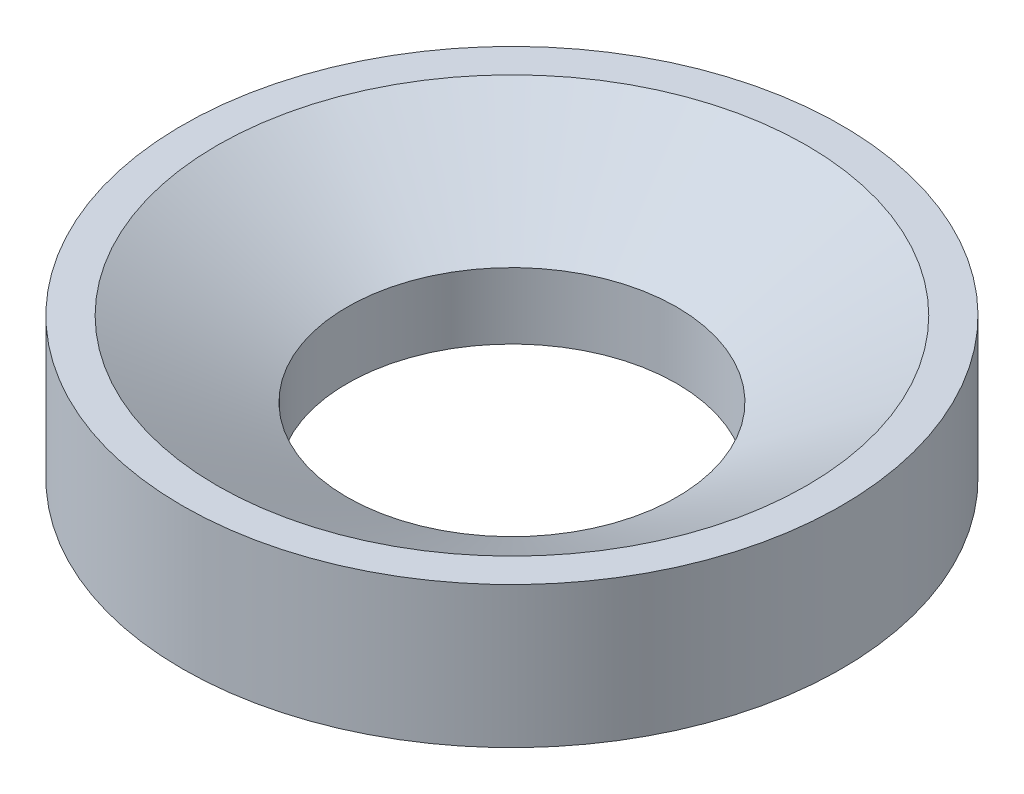
ISO-10303-21;
HEADER;
FILE_DESCRIPTION(('STEP AP214'),'2;1');
FILE_NAME('part.step','',(''),(''),'','','');
FILE_SCHEMA(('AUTOMOTIVE_DESIGN { 1 0 10303 214 1 1 1 1 }'));
ENDSEC;
DATA;
#1=APPLICATION_CONTEXT('core data for automotive mechanical design processes');
#2=APPLICATION_PROTOCOL_DEFINITION('international standard','automotive_design',2000,#1);
#3=PRODUCT_CONTEXT('',#1,'mechanical');
#4=PRODUCT('Part','Part','',(#3));
#5=PRODUCT_RELATED_PRODUCT_CATEGORY('part','',(#4));
#6=PRODUCT_DEFINITION_FORMATION('','',#4);
#7=PRODUCT_DEFINITION_CONTEXT('part definition',#1,'design');
#8=PRODUCT_DEFINITION('design','',#6,#7);
#9=PRODUCT_DEFINITION_SHAPE('','',#8);
#10=(LENGTH_UNIT() NAMED_UNIT(*) SI_UNIT(.MILLI.,.METRE.));
#11=(NAMED_UNIT(*) PLANE_ANGLE_UNIT() SI_UNIT($,.RADIAN.));
#12=(NAMED_UNIT(*) SI_UNIT($,.STERADIAN.) SOLID_ANGLE_UNIT());
#13=UNCERTAINTY_MEASURE_WITH_UNIT(LENGTH_MEASURE(1.E-05),#10,'distance_accuracy_value','');
#14=(GEOMETRIC_REPRESENTATION_CONTEXT(3) GLOBAL_UNCERTAINTY_ASSIGNED_CONTEXT((#13)) GLOBAL_UNIT_ASSIGNED_CONTEXT((#10,
#11,#12)) REPRESENTATION_CONTEXT('',''));
#15=CARTESIAN_POINT('',(0.,0.,0.));
#16=DIRECTION('',(0.,0.,1.));
#17=DIRECTION('',(1.,0.,0.));
#18=AXIS2_PLACEMENT_3D('',#15,#16,#17);
#19=CARTESIAN_POINT('',(0.,44.6684275184275,0.));
#20=DIRECTION('',(0.,1.,0.));
#21=DIRECTION('',(0.,0.,1.));
#22=AXIS2_PLACEMENT_3D('',#19,#20,#21);
#23=CYLINDRICAL_SURFACE('',#22,44.45);
#24=CARTESIAN_POINT('',(0.,0.,0.));
#25=DIRECTION('',(0.,1.,0.));
#26=DIRECTION('',(0.,0.,1.));
#27=AXIS2_PLACEMENT_3D('',#24,#25,#26);
#28=CIRCLE('',#27,44.45);
#29=CARTESIAN_POINT('',(0.,0.,44.45));
#30=VERTEX_POINT('',#29);
#31=EDGE_CURVE('E49',#30,#30,#28,.T.);
#32=ORIENTED_EDGE('',*,*,#31,.F.);
#33=EDGE_LOOP('',(#32));
#34=FACE_BOUND('',#33,.T.);
#35=CARTESIAN_POINT('',(0.,17.8594755567107,0.));
#36=DIRECTION('',(0.,1.,0.));
#37=DIRECTION('',(0.,0.,1.));
#38=AXIS2_PLACEMENT_3D('',#35,#36,#37);
#39=CIRCLE('',#38,44.45);
#40=CARTESIAN_POINT('',(0.,17.8594755567107,44.45));
#41=VERTEX_POINT('',#40);
#42=EDGE_CURVE('E10',#41,#41,#39,.T.);
#43=ORIENTED_EDGE('',*,*,#42,.T.);
#44=EDGE_LOOP('',(#43));
#45=FACE_BOUND('',#44,.T.);
#46=ADVANCED_FACE('F30',(#34,#45),#23,.F.);
#47=CARTESIAN_POINT('',(0.,38.1,0.));
#48=DIRECTION('',(0.,1.,0.));
#49=DIRECTION('',(0.,0.,1.));
#50=AXIS2_PLACEMENT_3D('',#47,#48,#49);
#51=CONICAL_SURFACE('',#50,79.5076167076167,1.0471975511966);
#52=ORIENTED_EDGE('',*,*,#42,.F.);
#53=EDGE_LOOP('',(#52));
#54=FACE_BOUND('',#53,.T.);
#55=CARTESIAN_POINT('',(0.,38.1,0.));
#56=DIRECTION('',(0.,1.,0.));
#57=DIRECTION('',(0.,0.,1.));
#58=AXIS2_PLACEMENT_3D('',#55,#56,#57);
#59=CIRCLE('',#58,79.5076167076167);
#60=CARTESIAN_POINT('',(0.,38.1,79.5076167076167));
#61=VERTEX_POINT('',#60);
#62=EDGE_CURVE('E36',#61,#61,#59,.T.);
#63=ORIENTED_EDGE('',*,*,#62,.T.);
#64=EDGE_LOOP('',(#63));
#65=FACE_BOUND('',#64,.T.);
#66=ADVANCED_FACE('F56',(#54,#65),#51,.F.);
#67=CARTESIAN_POINT('',(79.5076167076167,38.1,0.));
#68=DIRECTION('',(0.,-1.,0.));
#69=DIRECTION('',(0.,0.,-1.));
#70=AXIS2_PLACEMENT_3D('',#67,#68,#69);
#71=PLANE('',#70);
#72=ORIENTED_EDGE('',*,*,#62,.F.);
#73=EDGE_LOOP('',(#72));
#74=FACE_BOUND('',#73,.T.);
#75=CARTESIAN_POINT('',(0.,38.1,0.));
#76=DIRECTION('',(0.,1.,0.));
#77=DIRECTION('',(0.,0.,1.));
#78=AXIS2_PLACEMENT_3D('',#75,#76,#77);
#79=CIRCLE('',#78,88.9);
#80=CARTESIAN_POINT('',(0.,38.1,88.9));
#81=VERTEX_POINT('',#80);
#82=EDGE_CURVE('E40',#81,#81,#79,.T.);
#83=ORIENTED_EDGE('',*,*,#82,.T.);
#84=EDGE_LOOP('',(#83));
#85=FACE_BOUND('',#84,.T.);
#86=ADVANCED_FACE('F60',(#74,#85),#71,.F.);
#87=CARTESIAN_POINT('',(0.,44.6684275184275,0.));
#88=DIRECTION('',(0.,1.,0.));
#89=DIRECTION('',(0.,0.,1.));
#90=AXIS2_PLACEMENT_3D('',#87,#88,#89);
#91=CYLINDRICAL_SURFACE('',#90,88.9);
#92=ORIENTED_EDGE('',*,*,#82,.F.);
#93=EDGE_LOOP('',(#92));
#94=FACE_BOUND('',#93,.T.);
#95=CARTESIAN_POINT('',(0.,0.,0.));
#96=DIRECTION('',(0.,1.,0.));
#97=DIRECTION('',(0.,0.,1.));
#98=AXIS2_PLACEMENT_3D('',#95,#96,#97);
#99=CIRCLE('',#98,88.9);
#100=CARTESIAN_POINT('',(0.,0.,88.9));
#101=VERTEX_POINT('',#100);
#102=EDGE_CURVE('E44',#101,#101,#99,.T.);
#103=ORIENTED_EDGE('',*,*,#102,.T.);
#104=EDGE_LOOP('',(#103));
#105=FACE_BOUND('',#104,.T.);
#106=ADVANCED_FACE('F65',(#94,#105),#91,.T.);
#107=CARTESIAN_POINT('',(44.45,0.,0.));
#108=DIRECTION('',(0.,1.,0.));
#109=DIRECTION('',(0.,0.,1.));
#110=AXIS2_PLACEMENT_3D('',#107,#108,#109);
#111=PLANE('',#110);
#112=ORIENTED_EDGE('',*,*,#102,.F.);
#113=EDGE_LOOP('',(#112));
#114=FACE_BOUND('',#113,.T.);
#115=ORIENTED_EDGE('',*,*,#31,.T.);
#116=EDGE_LOOP('',(#115));
#117=FACE_BOUND('',#116,.T.);
#118=ADVANCED_FACE('F53',(#114,#117),#111,.F.);
#119=CLOSED_SHELL('',(#46,#66,#86,#106,#118));
#120=MANIFOLD_SOLID_BREP('B2',#119);
#121=ADVANCED_BREP_SHAPE_REPRESENTATION('',(#18,#120),#14);
#122=SHAPE_DEFINITION_REPRESENTATION(#9,#121);
ENDSEC;
END-ISO-10303-21;
